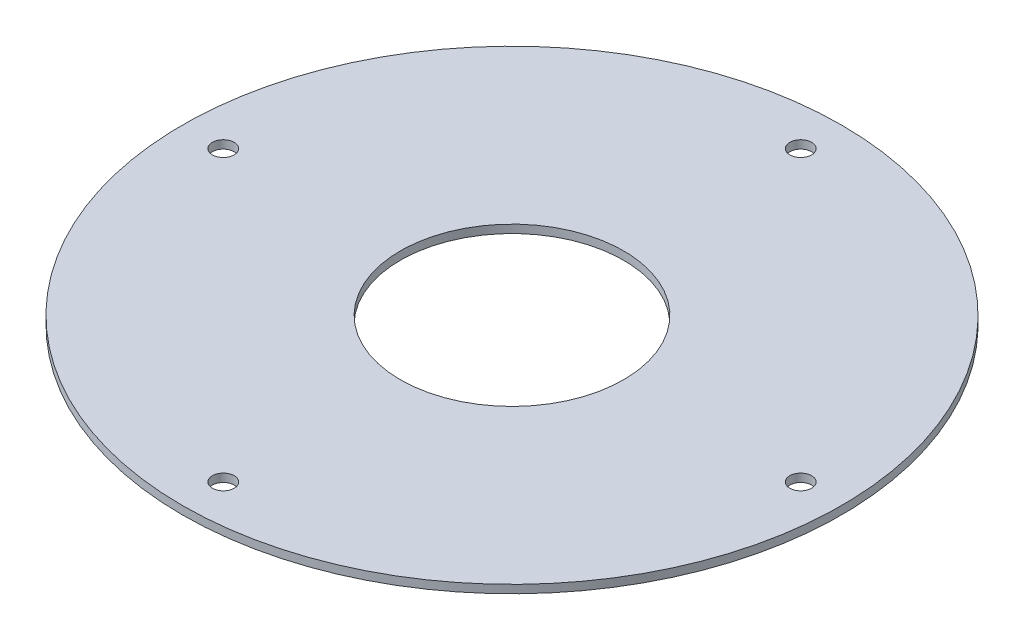
ISO-10303-21;
HEADER;
FILE_DESCRIPTION(('STEP AP214'),'2;1');
FILE_NAME('part.step','',(''),(''),'','','');
FILE_SCHEMA(('AUTOMOTIVE_DESIGN { 1 0 10303 214 1 1 1 1 }'));
ENDSEC;
DATA;
#1=APPLICATION_CONTEXT('core data for automotive mechanical design processes');
#2=APPLICATION_PROTOCOL_DEFINITION('international standard','automotive_design',2000,#1);
#3=PRODUCT_CONTEXT('',#1,'mechanical');
#4=PRODUCT('Part','Part','',(#3));
#5=PRODUCT_RELATED_PRODUCT_CATEGORY('part','',(#4));
#6=PRODUCT_DEFINITION_FORMATION('','',#4);
#7=PRODUCT_DEFINITION_CONTEXT('part definition',#1,'design');
#8=PRODUCT_DEFINITION('design','',#6,#7);
#9=PRODUCT_DEFINITION_SHAPE('','',#8);
#10=(LENGTH_UNIT() NAMED_UNIT(*) SI_UNIT(.MILLI.,.METRE.));
#11=(NAMED_UNIT(*) PLANE_ANGLE_UNIT() SI_UNIT($,.RADIAN.));
#12=(NAMED_UNIT(*) SI_UNIT($,.STERADIAN.) SOLID_ANGLE_UNIT());
#13=UNCERTAINTY_MEASURE_WITH_UNIT(LENGTH_MEASURE(1.E-05),#10,'distance_accuracy_value','');
#14=(GEOMETRIC_REPRESENTATION_CONTEXT(3) GLOBAL_UNCERTAINTY_ASSIGNED_CONTEXT((#13)) GLOBAL_UNIT_ASSIGNED_CONTEXT((#10,
#11,#12)) REPRESENTATION_CONTEXT('',''));
#15=CARTESIAN_POINT('',(0.,0.,0.));
#16=DIRECTION('',(0.,0.,1.));
#17=DIRECTION('',(1.,0.,0.));
#18=AXIS2_PLACEMENT_3D('',#15,#16,#17);
#19=CARTESIAN_POINT('',(0.,1.5,0.));
#20=DIRECTION('',(0.,1.,0.));
#21=DIRECTION('',(0.,0.,1.));
#22=AXIS2_PLACEMENT_3D('',#19,#20,#21);
#23=PLANE('',#22);
#24=CARTESIAN_POINT('',(-52.9999999999985,1.5,1.88293824976427E-12));
#25=DIRECTION('',(0.,1.,0.));
#26=DIRECTION('',(0.,0.,1.));
#27=AXIS2_PLACEMENT_3D('',#24,#25,#26);
#28=CIRCLE('',#27,2.00000000000242);
#29=CARTESIAN_POINT('',(-52.9999999999985,1.5,2.0000000000043));
#30=VERTEX_POINT('',#29);
#31=EDGE_CURVE('E68',#30,#30,#28,.T.);
#32=ORIENTED_EDGE('',*,*,#31,.F.);
#33=EDGE_LOOP('',(#32));
#34=FACE_BOUND('',#33,.T.);
#35=CARTESIAN_POINT('',(3.3827982215402E-12,1.5,53.));
#36=DIRECTION('',(0.,1.,0.));
#37=DIRECTION('',(0.,0.,1.));
#38=AXIS2_PLACEMENT_3D('',#35,#36,#37);
#39=CIRCLE('',#38,2.00000000000324);
#40=CARTESIAN_POINT('',(3.3827982215402E-12,1.5,55.0000000000032));
#41=VERTEX_POINT('',#40);
#42=EDGE_CURVE('E62',#41,#41,#39,.T.);
#43=ORIENTED_EDGE('',*,*,#42,.F.);
#44=EDGE_LOOP('',(#43));
#45=FACE_BOUND('',#44,.T.);
#46=CARTESIAN_POINT('',(53.0000000000015,1.5,-1.87644762172878E-12));
#47=DIRECTION('',(0.,1.,0.));
#48=DIRECTION('',(0.,0.,1.));
#49=AXIS2_PLACEMENT_3D('',#46,#47,#48);
#50=CIRCLE('',#49,2.00000000000117);
#51=CARTESIAN_POINT('',(53.0000000000015,1.5,1.9999999999993));
#52=VERTEX_POINT('',#51);
#53=EDGE_CURVE('E56',#52,#52,#50,.T.);
#54=ORIENTED_EDGE('',*,*,#53,.F.);
#55=EDGE_LOOP('',(#54));
#56=FACE_BOUND('',#55,.T.);
#57=CARTESIAN_POINT('',(-3.70097021917372E-13,1.5,-53.));
#58=DIRECTION('',(0.,1.,0.));
#59=DIRECTION('',(0.,0.,1.));
#60=AXIS2_PLACEMENT_3D('',#57,#58,#59);
#61=CIRCLE('',#60,2.);
#62=CARTESIAN_POINT('',(-3.70097021917372E-13,1.5,-51.));
#63=VERTEX_POINT('',#62);
#64=EDGE_CURVE('E50',#63,#63,#61,.T.);
#65=ORIENTED_EDGE('',*,*,#64,.F.);
#66=EDGE_LOOP('',(#65));
#67=FACE_BOUND('',#66,.T.);
#68=CARTESIAN_POINT('',(0.,1.5,0.));
#69=DIRECTION('',(0.,1.,0.));
#70=DIRECTION('',(0.,0.,1.));
#71=AXIS2_PLACEMENT_3D('',#68,#69,#70);
#72=CIRCLE('',#71,60.5);
#73=CARTESIAN_POINT('',(0.,1.5,60.5));
#74=VERTEX_POINT('',#73);
#75=EDGE_CURVE('E10',#74,#74,#72,.T.);
#76=ORIENTED_EDGE('',*,*,#75,.T.);
#77=EDGE_LOOP('',(#76));
#78=FACE_BOUND('',#77,.T.);
#79=CARTESIAN_POINT('',(0.,1.5,0.));
#80=DIRECTION('',(0.,1.,0.));
#81=DIRECTION('',(0.,0.,1.));
#82=AXIS2_PLACEMENT_3D('',#79,#80,#81);
#83=CIRCLE('',#82,20.5);
#84=CARTESIAN_POINT('',(0.,1.5,20.5));
#85=VERTEX_POINT('',#84);
#86=EDGE_CURVE('E42',#85,#85,#83,.T.);
#87=ORIENTED_EDGE('',*,*,#86,.F.);
#88=EDGE_LOOP('',(#87));
#89=FACE_BOUND('',#88,.T.);
#90=ADVANCED_FACE('F31',(#34,#45,#56,#67,#78,#89),#23,.T.);
#91=CARTESIAN_POINT('',(0.,0.,0.));
#92=DIRECTION('',(0.,1.,0.));
#93=DIRECTION('',(0.,0.,1.));
#94=AXIS2_PLACEMENT_3D('',#91,#92,#93);
#95=PLANE('',#94);
#96=CARTESIAN_POINT('',(-52.9999999999985,0.,1.88293824976427E-12));
#97=DIRECTION('',(0.,1.,0.));
#98=DIRECTION('',(0.,0.,1.));
#99=AXIS2_PLACEMENT_3D('',#96,#97,#98);
#100=CIRCLE('',#99,2.00000000000242);
#101=CARTESIAN_POINT('',(-52.9999999999985,0.,2.0000000000043));
#102=VERTEX_POINT('',#101);
#103=EDGE_CURVE('E65',#102,#102,#100,.T.);
#104=ORIENTED_EDGE('',*,*,#103,.T.);
#105=EDGE_LOOP('',(#104));
#106=FACE_BOUND('',#105,.T.);
#107=CARTESIAN_POINT('',(3.3827982215402E-12,0.,53.));
#108=DIRECTION('',(0.,1.,0.));
#109=DIRECTION('',(0.,0.,1.));
#110=AXIS2_PLACEMENT_3D('',#107,#108,#109);
#111=CIRCLE('',#110,2.00000000000324);
#112=CARTESIAN_POINT('',(3.3827982215402E-12,0.,55.0000000000032));
#113=VERTEX_POINT('',#112);
#114=EDGE_CURVE('E59',#113,#113,#111,.T.);
#115=ORIENTED_EDGE('',*,*,#114,.T.);
#116=EDGE_LOOP('',(#115));
#117=FACE_BOUND('',#116,.T.);
#118=CARTESIAN_POINT('',(53.0000000000015,0.,-1.87644762172878E-12));
#119=DIRECTION('',(0.,1.,0.));
#120=DIRECTION('',(0.,0.,1.));
#121=AXIS2_PLACEMENT_3D('',#118,#119,#120);
#122=CIRCLE('',#121,2.00000000000117);
#123=CARTESIAN_POINT('',(53.0000000000015,0.,1.9999999999993));
#124=VERTEX_POINT('',#123);
#125=EDGE_CURVE('E53',#124,#124,#122,.T.);
#126=ORIENTED_EDGE('',*,*,#125,.T.);
#127=EDGE_LOOP('',(#126));
#128=FACE_BOUND('',#127,.T.);
#129=CARTESIAN_POINT('',(-3.70097021917372E-13,0.,-53.));
#130=DIRECTION('',(0.,1.,0.));
#131=DIRECTION('',(0.,0.,1.));
#132=AXIS2_PLACEMENT_3D('',#129,#130,#131);
#133=CIRCLE('',#132,2.);
#134=CARTESIAN_POINT('',(-3.70097021917372E-13,0.,-51.));
#135=VERTEX_POINT('',#134);
#136=EDGE_CURVE('E47',#135,#135,#133,.T.);
#137=ORIENTED_EDGE('',*,*,#136,.T.);
#138=EDGE_LOOP('',(#137));
#139=FACE_BOUND('',#138,.T.);
#140=CARTESIAN_POINT('',(0.,0.,0.));
#141=DIRECTION('',(0.,1.,0.));
#142=DIRECTION('',(0.,0.,1.));
#143=AXIS2_PLACEMENT_3D('',#140,#141,#142);
#144=CIRCLE('',#143,60.5);
#145=CARTESIAN_POINT('',(0.,0.,60.5));
#146=VERTEX_POINT('',#145);
#147=EDGE_CURVE('E35',#146,#146,#144,.T.);
#148=ORIENTED_EDGE('',*,*,#147,.F.);
#149=EDGE_LOOP('',(#148));
#150=FACE_BOUND('',#149,.T.);
#151=CARTESIAN_POINT('',(0.,0.,0.));
#152=DIRECTION('',(0.,1.,0.));
#153=DIRECTION('',(0.,0.,1.));
#154=AXIS2_PLACEMENT_3D('',#151,#152,#153);
#155=CIRCLE('',#154,20.5);
#156=CARTESIAN_POINT('',(0.,0.,20.5));
#157=VERTEX_POINT('',#156);
#158=EDGE_CURVE('E44',#157,#157,#155,.T.);
#159=ORIENTED_EDGE('',*,*,#158,.T.);
#160=EDGE_LOOP('',(#159));
#161=FACE_BOUND('',#160,.T.);
#162=ADVANCED_FACE('F74',(#106,#117,#128,#139,#150,#161),#95,.F.);
#163=CARTESIAN_POINT('',(0.,1.5,0.));
#164=DIRECTION('',(0.,-1.,0.));
#165=DIRECTION('',(0.,0.,-1.));
#166=AXIS2_PLACEMENT_3D('',#163,#164,#165);
#167=CYLINDRICAL_SURFACE('',#166,60.5);
#168=ORIENTED_EDGE('',*,*,#75,.F.);
#169=EDGE_LOOP('',(#168));
#170=FACE_BOUND('',#169,.T.);
#171=ORIENTED_EDGE('',*,*,#147,.T.);
#172=EDGE_LOOP('',(#171));
#173=FACE_BOUND('',#172,.T.);
#174=ADVANCED_FACE('F33',(#170,#173),#167,.T.);
#175=CARTESIAN_POINT('',(0.,1.5,0.));
#176=DIRECTION('',(0.,-1.,0.));
#177=DIRECTION('',(0.,0.,-1.));
#178=AXIS2_PLACEMENT_3D('',#175,#176,#177);
#179=CYLINDRICAL_SURFACE('',#178,20.5);
#180=ORIENTED_EDGE('',*,*,#86,.T.);
#181=EDGE_LOOP('',(#180));
#182=FACE_BOUND('',#181,.T.);
#183=ORIENTED_EDGE('',*,*,#158,.F.);
#184=EDGE_LOOP('',(#183));
#185=FACE_BOUND('',#184,.T.);
#186=ADVANCED_FACE('F95',(#182,#185),#179,.F.);
#187=CARTESIAN_POINT('',(-3.70097021917372E-13,0.,-53.));
#188=DIRECTION('',(0.,1.,0.));
#189=DIRECTION('',(0.,0.,1.));
#190=AXIS2_PLACEMENT_3D('',#187,#188,#189);
#191=CYLINDRICAL_SURFACE('',#190,2.);
#192=ORIENTED_EDGE('',*,*,#136,.F.);
#193=EDGE_LOOP('',(#192));
#194=FACE_BOUND('',#193,.T.);
#195=ORIENTED_EDGE('',*,*,#64,.T.);
#196=EDGE_LOOP('',(#195));
#197=FACE_BOUND('',#196,.T.);
#198=ADVANCED_FACE('F98',(#194,#197),#191,.F.);
#199=CARTESIAN_POINT('',(53.0000000000015,0.,-1.87644762172878E-12));
#200=DIRECTION('',(0.,1.,0.));
#201=DIRECTION('',(0.,0.,1.));
#202=AXIS2_PLACEMENT_3D('',#199,#200,#201);
#203=CYLINDRICAL_SURFACE('',#202,2.00000000000117);
#204=ORIENTED_EDGE('',*,*,#125,.F.);
#205=EDGE_LOOP('',(#204));
#206=FACE_BOUND('',#205,.T.);
#207=ORIENTED_EDGE('',*,*,#53,.T.);
#208=EDGE_LOOP('',(#207));
#209=FACE_BOUND('',#208,.T.);
#210=ADVANCED_FACE('F110',(#206,#209),#203,.F.);
#211=CARTESIAN_POINT('',(3.3827982215402E-12,0.,53.));
#212=DIRECTION('',(0.,1.,0.));
#213=DIRECTION('',(0.,0.,1.));
#214=AXIS2_PLACEMENT_3D('',#211,#212,#213);
#215=CYLINDRICAL_SURFACE('',#214,2.00000000000324);
#216=ORIENTED_EDGE('',*,*,#114,.F.);
#217=EDGE_LOOP('',(#216));
#218=FACE_BOUND('',#217,.T.);
#219=ORIENTED_EDGE('',*,*,#42,.T.);
#220=EDGE_LOOP('',(#219));
#221=FACE_BOUND('',#220,.T.);
#222=ADVANCED_FACE('F80',(#218,#221),#215,.F.);
#223=CARTESIAN_POINT('',(-52.9999999999985,0.,1.88293824976427E-12));
#224=DIRECTION('',(0.,1.,0.));
#225=DIRECTION('',(0.,0.,1.));
#226=AXIS2_PLACEMENT_3D('',#223,#224,#225);
#227=CYLINDRICAL_SURFACE('',#226,2.00000000000242);
#228=ORIENTED_EDGE('',*,*,#103,.F.);
#229=EDGE_LOOP('',(#228));
#230=FACE_BOUND('',#229,.T.);
#231=ORIENTED_EDGE('',*,*,#31,.T.);
#232=EDGE_LOOP('',(#231));
#233=FACE_BOUND('',#232,.T.);
#234=ADVANCED_FACE('F77',(#230,#233),#227,.F.);
#235=CLOSED_SHELL('',(#90,#162,#174,#186,#198,#210,#222,#234));
#236=MANIFOLD_SOLID_BREP('B2',#235);
#237=ADVANCED_BREP_SHAPE_REPRESENTATION('',(#18,#236),#14);
#238=SHAPE_DEFINITION_REPRESENTATION(#9,#237);
ENDSEC;
END-ISO-10303-21;
